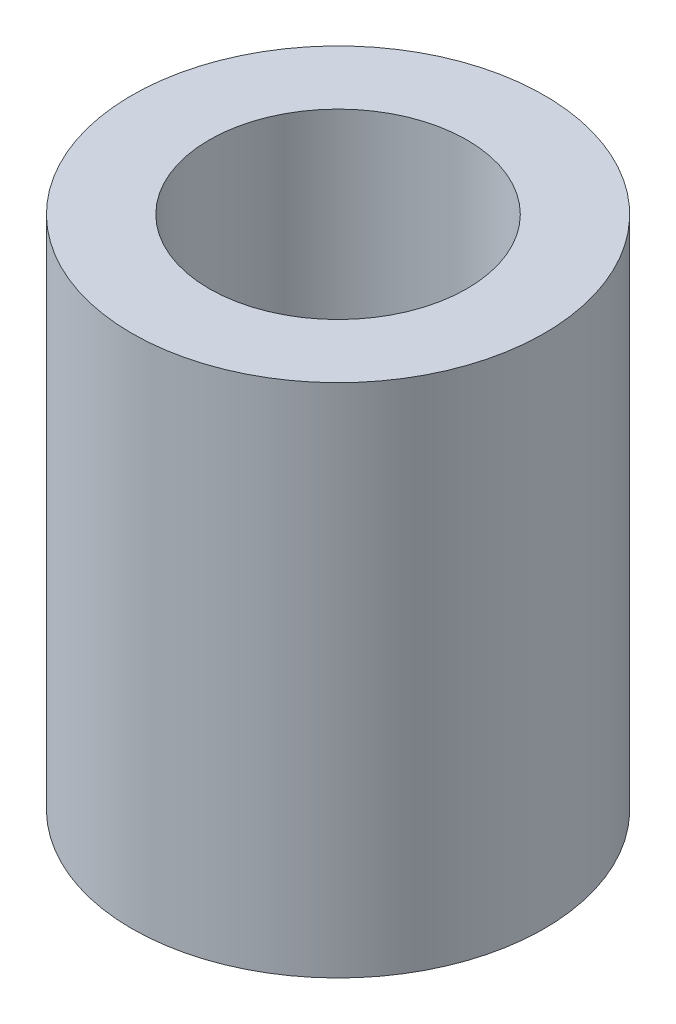
ISO-10303-21;
HEADER;
FILE_DESCRIPTION(('STEP AP214'),'2;1');
FILE_NAME('part.step','',(''),(''),'','','');
FILE_SCHEMA(('AUTOMOTIVE_DESIGN { 1 0 10303 214 1 1 1 1 }'));
ENDSEC;
DATA;
#1=APPLICATION_CONTEXT('core data for automotive mechanical design processes');
#2=APPLICATION_PROTOCOL_DEFINITION('international standard','automotive_design',2000,#1);
#3=PRODUCT_CONTEXT('',#1,'mechanical');
#4=PRODUCT('Part','Part','',(#3));
#5=PRODUCT_RELATED_PRODUCT_CATEGORY('part','',(#4));
#6=PRODUCT_DEFINITION_FORMATION('','',#4);
#7=PRODUCT_DEFINITION_CONTEXT('part definition',#1,'design');
#8=PRODUCT_DEFINITION('design','',#6,#7);
#9=PRODUCT_DEFINITION_SHAPE('','',#8);
#10=(LENGTH_UNIT() NAMED_UNIT(*) SI_UNIT(.MILLI.,.METRE.));
#11=(NAMED_UNIT(*) PLANE_ANGLE_UNIT() SI_UNIT($,.RADIAN.));
#12=(NAMED_UNIT(*) SI_UNIT($,.STERADIAN.) SOLID_ANGLE_UNIT());
#13=UNCERTAINTY_MEASURE_WITH_UNIT(LENGTH_MEASURE(1.E-05),#10,'distance_accuracy_value','');
#14=(GEOMETRIC_REPRESENTATION_CONTEXT(3) GLOBAL_UNCERTAINTY_ASSIGNED_CONTEXT((#13)) GLOBAL_UNIT_ASSIGNED_CONTEXT((#10,
#11,#12)) REPRESENTATION_CONTEXT('',''));
#15=CARTESIAN_POINT('',(0.,0.,0.));
#16=DIRECTION('',(0.,0.,1.));
#17=DIRECTION('',(1.,0.,0.));
#18=AXIS2_PLACEMENT_3D('',#15,#16,#17);
#19=CARTESIAN_POINT('',(0.,5.,0.));
#20=DIRECTION('',(0.,1.,0.));
#21=DIRECTION('',(0.,0.,1.));
#22=AXIS2_PLACEMENT_3D('',#19,#20,#21);
#23=PLANE('',#22);
#24=CARTESIAN_POINT('',(0.,5.,0.));
#25=DIRECTION('',(0.,1.,0.));
#26=DIRECTION('',(0.,0.,1.));
#27=AXIS2_PLACEMENT_3D('',#24,#25,#26);
#28=CIRCLE('',#27,2.);
#29=CARTESIAN_POINT('',(0.,5.,2.));
#30=VERTEX_POINT('',#29);
#31=EDGE_CURVE('E10',#30,#30,#28,.T.);
#32=ORIENTED_EDGE('',*,*,#31,.T.);
#33=EDGE_LOOP('',(#32));
#34=FACE_BOUND('',#33,.T.);
#35=CARTESIAN_POINT('',(0.,5.,0.));
#36=DIRECTION('',(0.,1.,0.));
#37=DIRECTION('',(0.,0.,1.));
#38=AXIS2_PLACEMENT_3D('',#35,#36,#37);
#39=CIRCLE('',#38,1.25);
#40=CARTESIAN_POINT('',(0.,5.,1.25));
#41=VERTEX_POINT('',#40);
#42=EDGE_CURVE('E44',#41,#41,#39,.T.);
#43=ORIENTED_EDGE('',*,*,#42,.F.);
#44=EDGE_LOOP('',(#43));
#45=FACE_BOUND('',#44,.T.);
#46=ADVANCED_FACE('F33',(#34,#45),#23,.T.);
#47=CARTESIAN_POINT('',(0.,0.,0.));
#48=DIRECTION('',(0.,1.,0.));
#49=DIRECTION('',(0.,0.,1.));
#50=AXIS2_PLACEMENT_3D('',#47,#48,#49);
#51=PLANE('',#50);
#52=CARTESIAN_POINT('',(0.,0.,0.));
#53=DIRECTION('',(0.,1.,0.));
#54=DIRECTION('',(0.,0.,1.));
#55=AXIS2_PLACEMENT_3D('',#52,#53,#54);
#56=CIRCLE('',#55,2.);
#57=CARTESIAN_POINT('',(0.,0.,2.));
#58=VERTEX_POINT('',#57);
#59=EDGE_CURVE('E37',#58,#58,#56,.T.);
#60=ORIENTED_EDGE('',*,*,#59,.F.);
#61=EDGE_LOOP('',(#60));
#62=FACE_BOUND('',#61,.T.);
#63=CARTESIAN_POINT('',(0.,0.,0.));
#64=DIRECTION('',(0.,1.,0.));
#65=DIRECTION('',(0.,0.,1.));
#66=AXIS2_PLACEMENT_3D('',#63,#64,#65);
#67=CIRCLE('',#66,1.25);
#68=CARTESIAN_POINT('',(0.,0.,1.25));
#69=VERTEX_POINT('',#68);
#70=EDGE_CURVE('E46',#69,#69,#67,.T.);
#71=ORIENTED_EDGE('',*,*,#70,.T.);
#72=EDGE_LOOP('',(#71));
#73=FACE_BOUND('',#72,.T.);
#74=ADVANCED_FACE('F56',(#62,#73),#51,.F.);
#75=CARTESIAN_POINT('',(0.,5.,0.));
#76=DIRECTION('',(0.,-1.,0.));
#77=DIRECTION('',(0.,0.,-1.));
#78=AXIS2_PLACEMENT_3D('',#75,#76,#77);
#79=CYLINDRICAL_SURFACE('',#78,2.);
#80=ORIENTED_EDGE('',*,*,#31,.F.);
#81=EDGE_LOOP('',(#80));
#82=FACE_BOUND('',#81,.T.);
#83=ORIENTED_EDGE('',*,*,#59,.T.);
#84=EDGE_LOOP('',(#83));
#85=FACE_BOUND('',#84,.T.);
#86=ADVANCED_FACE('F35',(#82,#85),#79,.T.);
#87=CARTESIAN_POINT('',(0.,5.,0.));
#88=DIRECTION('',(0.,-1.,0.));
#89=DIRECTION('',(0.,0.,-1.));
#90=AXIS2_PLACEMENT_3D('',#87,#88,#89);
#91=CYLINDRICAL_SURFACE('',#90,1.25);
#92=ORIENTED_EDGE('',*,*,#42,.T.);
#93=EDGE_LOOP('',(#92));
#94=FACE_BOUND('',#93,.T.);
#95=ORIENTED_EDGE('',*,*,#70,.F.);
#96=EDGE_LOOP('',(#95));
#97=FACE_BOUND('',#96,.T.);
#98=ADVANCED_FACE('F52',(#94,#97),#91,.F.);
#99=CLOSED_SHELL('',(#46,#74,#86,#98));
#100=MANIFOLD_SOLID_BREP('B2',#99);
#101=ADVANCED_BREP_SHAPE_REPRESENTATION('',(#18,#100),#14);
#102=SHAPE_DEFINITION_REPRESENTATION(#9,#101);
ENDSEC;
END-ISO-10303-21;
